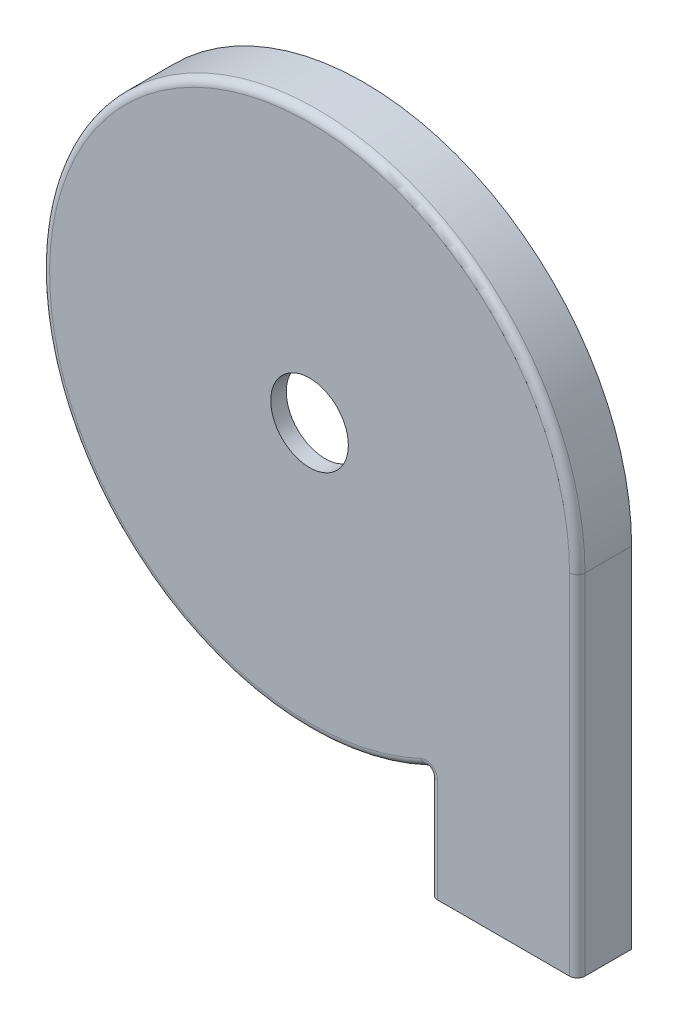
ISO-10303-21;
HEADER;
FILE_DESCRIPTION(('STEP AP214'),'2;1');
FILE_NAME('part.step','',(''),(''),'','','');
FILE_SCHEMA(('AUTOMOTIVE_DESIGN { 1 0 10303 214 1 1 1 1 }'));
ENDSEC;
DATA;
#1=APPLICATION_CONTEXT('core data for automotive mechanical design processes');
#2=APPLICATION_PROTOCOL_DEFINITION('international standard','automotive_design',2000,#1);
#3=PRODUCT_CONTEXT('',#1,'mechanical');
#4=PRODUCT('Part','Part','',(#3));
#5=PRODUCT_RELATED_PRODUCT_CATEGORY('part','',(#4));
#6=PRODUCT_DEFINITION_FORMATION('','',#4);
#7=PRODUCT_DEFINITION_CONTEXT('part definition',#1,'design');
#8=PRODUCT_DEFINITION('design','',#6,#7);
#9=PRODUCT_DEFINITION_SHAPE('','',#8);
#10=(LENGTH_UNIT() NAMED_UNIT(*) SI_UNIT(.MILLI.,.METRE.));
#11=(NAMED_UNIT(*) PLANE_ANGLE_UNIT() SI_UNIT($,.RADIAN.));
#12=(NAMED_UNIT(*) SI_UNIT($,.STERADIAN.) SOLID_ANGLE_UNIT());
#13=UNCERTAINTY_MEASURE_WITH_UNIT(LENGTH_MEASURE(1.E-05),#10,'distance_accuracy_value','');
#14=(GEOMETRIC_REPRESENTATION_CONTEXT(3) GLOBAL_UNCERTAINTY_ASSIGNED_CONTEXT((#13)) GLOBAL_UNIT_ASSIGNED_CONTEXT((#10,
#11,#12)) REPRESENTATION_CONTEXT('',''));
#15=CARTESIAN_POINT('',(0.,0.,0.));
#16=DIRECTION('',(0.,0.,1.));
#17=DIRECTION('',(1.,0.,0.));
#18=AXIS2_PLACEMENT_3D('',#15,#16,#17);
#19=CARTESIAN_POINT('',(14.5518746687865,-25.9953256212916,2.));
#20=DIRECTION('',(1.,0.,0.));
#21=DIRECTION('',(0.,1.,0.));
#22=AXIS2_PLACEMENT_3D('',#19,#20,#21);
#23=PLANE('',#22);
#24=DIRECTION('',(0.,0.,-1.));
#25=VECTOR('',#24,1.);
#26=CARTESIAN_POINT('',(14.5518746687865,-39.3725490196078,1.));
#27=LINE('',#26,#25);
#28=CARTESIAN_POINT('',(14.5518746687865,-39.3725490196078,1.));
#29=VERTEX_POINT('',#28);
#30=CARTESIAN_POINT('',(14.5518746687865,-39.3725490196078,-5.));
#31=VERTEX_POINT('',#30);
#32=EDGE_CURVE('E165',#29,#31,#27,.T.);
#33=ORIENTED_EDGE('',*,*,#32,.F.);
#34=DIRECTION('',(0.,-1.,0.));
#35=VECTOR('',#34,1.);
#36=CARTESIAN_POINT('',(14.5518746687865,-25.9953256212916,1.));
#37=LINE('',#36,#35);
#38=CARTESIAN_POINT('',(14.5518746687865,-25.9953256212916,1.));
#39=VERTEX_POINT('',#38);
#40=EDGE_CURVE('E251',#29,#39,#37,.F.);
#41=ORIENTED_EDGE('',*,*,#40,.T.);
#42=DIRECTION('',(0.,0.,-1.));
#43=VECTOR('',#42,1.);
#44=CARTESIAN_POINT('',(14.5518746687865,-25.9953256212916,2.));
#45=LINE('',#44,#43);
#46=CARTESIAN_POINT('',(14.5518746687865,-25.9953256212916,-5.));
#47=VERTEX_POINT('',#46);
#48=EDGE_CURVE('E190',#39,#47,#45,.T.);
#49=ORIENTED_EDGE('',*,*,#48,.T.);
#50=DIRECTION('',(0.,-1.,0.));
#51=VECTOR('',#50,1.);
#52=CARTESIAN_POINT('',(14.5518746687865,-25.9953256212916,-5.));
#53=LINE('',#52,#51);
#54=EDGE_CURVE('E182',#47,#31,#53,.T.);
#55=ORIENTED_EDGE('',*,*,#54,.T.);
#56=EDGE_LOOP('',(#33,#41,#49,#55));
#57=FACE_BOUND('',#56,.T.);
#58=ADVANCED_FACE('F43',(#57),#23,.F.);
#59=CARTESIAN_POINT('',(33.5518746687865,-41.3725490196078,2.));
#60=DIRECTION('',(-1.,0.,0.));
#61=DIRECTION('',(0.,0.,1.));
#62=AXIS2_PLACEMENT_3D('',#59,#60,#61);
#63=PLANE('',#62);
#64=DIRECTION('',(0.,0.,1.));
#65=VECTOR('',#64,1.);
#66=CARTESIAN_POINT('',(33.5518746687865,-39.3725490196078,-5.));
#67=LINE('',#66,#65);
#68=CARTESIAN_POINT('',(33.5518746687865,-39.3725490196078,-5.));
#69=VERTEX_POINT('',#68);
#70=CARTESIAN_POINT('',(33.5518746687865,-39.3725490196078,1.));
#71=VERTEX_POINT('',#70);
#72=EDGE_CURVE('E61',#69,#71,#67,.T.);
#73=ORIENTED_EDGE('',*,*,#72,.F.);
#74=DIRECTION('',(0.,1.,0.));
#75=VECTOR('',#74,1.);
#76=CARTESIAN_POINT('',(33.5518746687865,-41.3725490196078,-5.));
#77=LINE('',#76,#75);
#78=CARTESIAN_POINT('',(33.5518746687865,5.62745098039216,-5.));
#79=VERTEX_POINT('',#78);
#80=EDGE_CURVE('E192',#69,#79,#77,.T.);
#81=ORIENTED_EDGE('',*,*,#80,.T.);
#82=DIRECTION('',(0.,0.,-1.));
#83=VECTOR('',#82,1.);
#84=CARTESIAN_POINT('',(33.5518746687865,5.62745098039216,2.));
#85=LINE('',#84,#83);
#86=CARTESIAN_POINT('',(33.5518746687865,5.62745098039216,1.));
#87=VERTEX_POINT('',#86);
#88=EDGE_CURVE('E228',#87,#79,#85,.T.);
#89=ORIENTED_EDGE('',*,*,#88,.F.);
#90=DIRECTION('',(0.,1.,0.));
#91=VECTOR('',#90,1.);
#92=CARTESIAN_POINT('',(33.5518746687865,-41.3725490196078,1.));
#93=LINE('',#92,#91);
#94=EDGE_CURVE('E247',#87,#71,#93,.F.);
#95=ORIENTED_EDGE('',*,*,#94,.T.);
#96=EDGE_LOOP('',(#73,#81,#89,#95));
#97=FACE_BOUND('',#96,.T.);
#98=ADVANCED_FACE('F420',(#97),#63,.F.);
#99=CARTESIAN_POINT('',(-0.948125331213558,5.62745098039216,2.));
#100=DIRECTION('',(0.,0.,1.));
#101=DIRECTION('',(1.,0.,0.));
#102=AXIS2_PLACEMENT_3D('',#99,#100,#101);
#103=PLANE('',#102);
#104=CARTESIAN_POINT('',(-0.948125331213558,5.62745098039216,2.));
#105=DIRECTION('',(0.,0.,1.));
#106=DIRECTION('',(1.,0.,0.));
#107=AXIS2_PLACEMENT_3D('',#104,#105,#106);
#108=CIRCLE('',#107,5.);
#109=CARTESIAN_POINT('',(4.05187466878644,5.62745098039216,2.));
#110=VERTEX_POINT('',#109);
#111=EDGE_CURVE('E393',#110,#110,#108,.T.);
#112=ORIENTED_EDGE('',*,*,#111,.F.);
#113=EDGE_LOOP('',(#112));
#114=FACE_BOUND('',#113,.T.);
#115=DIRECTION('',(0.,-1.,0.));
#116=VECTOR('',#115,1.);
#117=CARTESIAN_POINT('',(15.5518746687865,-41.3725490196078,2.));
#118=LINE('',#117,#116);
#119=CARTESIAN_POINT('',(15.5518746687864,-25.9953256212916,2.));
#120=VERTEX_POINT('',#119);
#121=CARTESIAN_POINT('',(15.5518746687865,-39.3725490196078,2.));
#122=VERTEX_POINT('',#121);
#123=EDGE_CURVE('E240',#120,#122,#118,.T.);
#124=ORIENTED_EDGE('',*,*,#123,.T.);
#125=DIRECTION('',(-1.,0.,0.));
#126=VECTOR('',#125,1.);
#127=CARTESIAN_POINT('',(32.5518746687865,-39.3725490196078,2.));
#128=LINE('',#127,#126);
#129=CARTESIAN_POINT('',(32.5518746687865,-39.3725490196078,2.));
#130=VERTEX_POINT('',#129);
#131=EDGE_CURVE('E399',#130,#122,#128,.T.);
#132=ORIENTED_EDGE('',*,*,#131,.F.);
#133=DIRECTION('',(0.,1.,0.));
#134=VECTOR('',#133,1.);
#135=CARTESIAN_POINT('',(32.5518746687865,5.62745098039216,2.));
#136=LINE('',#135,#134);
#137=CARTESIAN_POINT('',(32.5518746687865,5.62745098039216,2.));
#138=VERTEX_POINT('',#137);
#139=EDGE_CURVE('E244',#130,#138,#136,.T.);
#140=ORIENTED_EDGE('',*,*,#139,.T.);
#141=CARTESIAN_POINT('',(-0.948125331213558,5.62745098039216,2.));
#142=DIRECTION('',(0.,0.,1.));
#143=DIRECTION('',(1.,0.,0.));
#144=AXIS2_PLACEMENT_3D('',#141,#142,#143);
#145=CIRCLE('',#144,33.5);
#146=CARTESIAN_POINT('',(13.4090175259293,-24.6400637669338,2.));
#147=VERTEX_POINT('',#146);
#148=EDGE_CURVE('E234',#138,#147,#145,.T.);
#149=ORIENTED_EDGE('',*,*,#148,.T.);
#150=CARTESIAN_POINT('',(14.0518746687864,-25.9953256212916,2.));
#151=DIRECTION('',(0.,0.,1.));
#152=DIRECTION('',(1.,0.,0.));
#153=AXIS2_PLACEMENT_3D('',#150,#151,#152);
#154=CIRCLE('',#153,1.49999999999999);
#155=EDGE_CURVE('E237',#147,#120,#154,.F.);
#156=ORIENTED_EDGE('',*,*,#155,.T.);
#157=EDGE_LOOP('',(#124,#132,#140,#149,#156));
#158=FACE_BOUND('',#157,.T.);
#159=ADVANCED_FACE('F435',(#114,#158),#103,.T.);
#160=CARTESIAN_POINT('',(-0.948125331213558,5.62745098039216,-5.));
#161=DIRECTION('',(0.,0.,1.));
#162=DIRECTION('',(1.,0.,0.));
#163=AXIS2_PLACEMENT_3D('',#160,#161,#162);
#164=PLANE('',#163);
#165=DIRECTION('',(1.,0.,0.));
#166=VECTOR('',#165,1.);
#167=CARTESIAN_POINT('',(14.5518746687865,-39.3725490196078,-5.));
#168=LINE('',#167,#166);
#169=CARTESIAN_POINT('',(16.5518746687864,-39.3725490196078,-5.));
#170=VERTEX_POINT('',#169);
#171=EDGE_CURVE('E168',#31,#170,#168,.T.);
#172=ORIENTED_EDGE('',*,*,#171,.F.);
#173=ORIENTED_EDGE('',*,*,#54,.F.);
#174=CARTESIAN_POINT('',(14.0518746687864,-25.9953256212916,-5.));
#175=DIRECTION('',(0.,0.,-1.));
#176=DIRECTION('',(1.,0.,0.));
#177=AXIS2_PLACEMENT_3D('',#174,#175,#176);
#178=CIRCLE('',#177,0.5);
#179=CARTESIAN_POINT('',(13.8375889545007,-25.543571669839,-5.));
#180=VERTEX_POINT('',#179);
#181=EDGE_CURVE('E209',#180,#47,#178,.T.);
#182=ORIENTED_EDGE('',*,*,#181,.F.);
#183=CARTESIAN_POINT('',(-0.948125331213558,5.62745098039216,-5.));
#184=DIRECTION('',(0.,0.,1.));
#185=DIRECTION('',(1.,0.,0.));
#186=AXIS2_PLACEMENT_3D('',#183,#184,#185);
#187=CIRCLE('',#186,34.5);
#188=EDGE_CURVE('E197',#79,#180,#187,.T.);
#189=ORIENTED_EDGE('',*,*,#188,.F.);
#190=ORIENTED_EDGE('',*,*,#80,.F.);
#191=DIRECTION('',(1.,0.,0.));
#192=VECTOR('',#191,1.);
#193=CARTESIAN_POINT('',(31.5518746687865,-39.3725490196078,-5.));
#194=LINE('',#193,#192);
#195=CARTESIAN_POINT('',(31.5518746687865,-39.3725490196078,-5.));
#196=VERTEX_POINT('',#195);
#197=EDGE_CURVE('E407',#196,#69,#194,.T.);
#198=ORIENTED_EDGE('',*,*,#197,.F.);
#199=DIRECTION('',(0.,1.,0.));
#200=VECTOR('',#199,1.);
#201=CARTESIAN_POINT('',(31.5518746687865,-39.3725490196078,-5.));
#202=LINE('',#201,#200);
#203=CARTESIAN_POINT('',(31.5518746687864,5.62745098039216,-5.));
#204=VERTEX_POINT('',#203);
#205=EDGE_CURVE('E306',#196,#204,#202,.T.);
#206=ORIENTED_EDGE('',*,*,#205,.T.);
#207=CARTESIAN_POINT('',(-0.948125331213558,5.62745098039216,-5.));
#208=DIRECTION('',(0.,0.,1.));
#209=DIRECTION('',(1.,0.,0.));
#210=AXIS2_PLACEMENT_3D('',#207,#208,#209);
#211=CIRCLE('',#210,32.5);
#212=CARTESIAN_POINT('',(12.9804460973579,-23.7365558640285,-5.));
#213=VERTEX_POINT('',#212);
#214=EDGE_CURVE('E310',#204,#213,#211,.T.);
#215=ORIENTED_EDGE('',*,*,#214,.T.);
#216=CARTESIAN_POINT('',(14.0518746687864,-25.9953256212916,-5.));
#217=DIRECTION('',(0.,0.,-1.));
#218=DIRECTION('',(1.,0.,0.));
#219=AXIS2_PLACEMENT_3D('',#216,#217,#218);
#220=CIRCLE('',#219,2.5);
#221=CARTESIAN_POINT('',(16.5518746687864,-25.9953256212916,-5.));
#222=VERTEX_POINT('',#221);
#223=EDGE_CURVE('E314',#213,#222,#220,.T.);
#224=ORIENTED_EDGE('',*,*,#223,.T.);
#225=DIRECTION('',(0.,-1.,0.));
#226=VECTOR('',#225,1.);
#227=CARTESIAN_POINT('',(16.5518746687864,-25.9953256212916,-5.));
#228=LINE('',#227,#226);
#229=EDGE_CURVE('E186',#222,#170,#228,.T.);
#230=ORIENTED_EDGE('',*,*,#229,.T.);
#231=EDGE_LOOP('',(#172,#173,#182,#189,#190,#198,#206,#215,#224,#230));
#232=FACE_BOUND('',#231,.T.);
#233=ADVANCED_FACE('F180',(#232),#164,.F.);
#234=CARTESIAN_POINT('',(16.5518746687864,-25.9953256212916,-5.));
#235=DIRECTION('',(-1.,0.,0.));
#236=DIRECTION('',(0.,0.,1.));
#237=AXIS2_PLACEMENT_3D('',#234,#235,#236);
#238=PLANE('',#237);
#239=DIRECTION('',(0.,0.,1.));
#240=VECTOR('',#239,1.);
#241=CARTESIAN_POINT('',(16.5518746687864,-39.3725490196078,-5.));
#242=LINE('',#241,#240);
#243=CARTESIAN_POINT('',(16.5518746687864,-39.3725490196078,0.));
#244=VERTEX_POINT('',#243);
#245=EDGE_CURVE('E188',#170,#244,#242,.T.);
#246=ORIENTED_EDGE('',*,*,#245,.F.);
#247=ORIENTED_EDGE('',*,*,#229,.F.);
#248=DIRECTION('',(0.,0.,1.));
#249=VECTOR('',#248,1.);
#250=CARTESIAN_POINT('',(16.5518746687864,-25.9953256212916,-5.));
#251=LINE('',#250,#249);
#252=CARTESIAN_POINT('',(16.5518746687864,-25.9953256212916,0.));
#253=VERTEX_POINT('',#252);
#254=EDGE_CURVE('E193',#222,#253,#251,.T.);
#255=ORIENTED_EDGE('',*,*,#254,.T.);
#256=DIRECTION('',(0.,-1.,0.));
#257=VECTOR('',#256,1.);
#258=CARTESIAN_POINT('',(16.5518746687864,-25.9953256212916,0.));
#259=LINE('',#258,#257);
#260=EDGE_CURVE('E293',#253,#244,#259,.T.);
#261=ORIENTED_EDGE('',*,*,#260,.T.);
#262=EDGE_LOOP('',(#246,#247,#255,#261));
#263=FACE_BOUND('',#262,.T.);
#264=ADVANCED_FACE('F364',(#263),#238,.F.);
#265=CARTESIAN_POINT('',(31.5518746687865,-39.3725490196078,-5.));
#266=DIRECTION('',(1.,0.,0.));
#267=DIRECTION('',(0.,1.,0.));
#268=AXIS2_PLACEMENT_3D('',#265,#266,#267);
#269=PLANE('',#268);
#270=DIRECTION('',(0.,0.,-1.));
#271=VECTOR('',#270,1.);
#272=CARTESIAN_POINT('',(31.5518746687865,-39.3725490196078,0.));
#273=LINE('',#272,#271);
#274=CARTESIAN_POINT('',(31.5518746687865,-39.3725490196078,0.));
#275=VERTEX_POINT('',#274);
#276=EDGE_CURVE('E358',#275,#196,#273,.T.);
#277=ORIENTED_EDGE('',*,*,#276,.F.);
#278=DIRECTION('',(0.,1.,0.));
#279=VECTOR('',#278,1.);
#280=CARTESIAN_POINT('',(31.5518746687865,-39.3725490196078,0.));
#281=LINE('',#280,#279);
#282=CARTESIAN_POINT('',(31.5518746687864,5.62745098039216,0.));
#283=VERTEX_POINT('',#282);
#284=EDGE_CURVE('E321',#275,#283,#281,.T.);
#285=ORIENTED_EDGE('',*,*,#284,.T.);
#286=DIRECTION('',(0.,0.,1.));
#287=VECTOR('',#286,1.);
#288=CARTESIAN_POINT('',(31.5518746687864,5.62745098039216,-5.));
#289=LINE('',#288,#287);
#290=CARTESIAN_POINT('',(31.5518746687864,5.62745098039216,-3.));
#291=VERTEX_POINT('',#290);
#292=EDGE_CURVE('E317',#291,#283,#289,.T.);
#293=ORIENTED_EDGE('',*,*,#292,.F.);
#294=DIRECTION('',(0.,0.,-1.));
#295=VECTOR('',#294,1.);
#296=CARTESIAN_POINT('',(31.5518746687864,5.62745098039216,-3.));
#297=LINE('',#296,#295);
#298=CARTESIAN_POINT('',(31.5518746687864,5.62745098039216,-4.));
#299=VERTEX_POINT('',#298);
#300=EDGE_CURVE('E294',#291,#299,#297,.T.);
#301=ORIENTED_EDGE('',*,*,#300,.T.);
#302=EDGE_CURVE('E203',#204,#299,#289,.T.);
#303=ORIENTED_EDGE('',*,*,#302,.F.);
#304=ORIENTED_EDGE('',*,*,#205,.F.);
#305=EDGE_LOOP('',(#277,#285,#293,#301,#303,#304));
#306=FACE_BOUND('',#305,.T.);
#307=ADVANCED_FACE('F355',(#306),#269,.F.);
#308=CARTESIAN_POINT('',(-0.948125331213558,5.62745098039216,0.));
#309=DIRECTION('',(0.,0.,1.));
#310=DIRECTION('',(1.,0.,0.));
#311=AXIS2_PLACEMENT_3D('',#308,#309,#310);
#312=PLANE('',#311);
#313=CARTESIAN_POINT('',(-0.948125331213558,5.62745098039216,0.));
#314=DIRECTION('',(0.,0.,1.));
#315=DIRECTION('',(1.,0.,0.));
#316=AXIS2_PLACEMENT_3D('',#313,#314,#315);
#317=CIRCLE('',#316,5.);
#318=CARTESIAN_POINT('',(4.05187466878644,5.62745098039216,0.));
#319=VERTEX_POINT('',#318);
#320=EDGE_CURVE('E47',#319,#319,#317,.T.);
#321=ORIENTED_EDGE('',*,*,#320,.T.);
#322=EDGE_LOOP('',(#321));
#323=FACE_BOUND('',#322,.T.);
#324=DIRECTION('',(1.,0.,0.));
#325=VECTOR('',#324,1.);
#326=CARTESIAN_POINT('',(16.5518746687864,-39.3725490196078,0.));
#327=LINE('',#326,#325);
#328=EDGE_CURVE('E412',#244,#275,#327,.T.);
#329=ORIENTED_EDGE('',*,*,#328,.F.);
#330=ORIENTED_EDGE('',*,*,#260,.F.);
#331=CARTESIAN_POINT('',(14.0518746687864,-25.9953256212916,0.));
#332=DIRECTION('',(0.,0.,-1.));
#333=DIRECTION('',(1.,0.,0.));
#334=AXIS2_PLACEMENT_3D('',#331,#332,#333);
#335=CIRCLE('',#334,2.5);
#336=CARTESIAN_POINT('',(12.9804460973579,-23.7365558640285,0.));
#337=VERTEX_POINT('',#336);
#338=EDGE_CURVE('E307',#337,#253,#335,.T.);
#339=ORIENTED_EDGE('',*,*,#338,.F.);
#340=CARTESIAN_POINT('',(-0.948125331213558,5.62745098039216,0.));
#341=DIRECTION('',(0.,0.,1.));
#342=DIRECTION('',(1.,0.,0.));
#343=AXIS2_PLACEMENT_3D('',#340,#341,#342);
#344=CIRCLE('',#343,32.5);
#345=EDGE_CURVE('E324',#283,#337,#344,.T.);
#346=ORIENTED_EDGE('',*,*,#345,.F.);
#347=ORIENTED_EDGE('',*,*,#284,.F.);
#348=EDGE_LOOP('',(#329,#330,#339,#346,#347));
#349=FACE_BOUND('',#348,.T.);
#350=ADVANCED_FACE('F361',(#323,#349),#312,.F.);
#351=CARTESIAN_POINT('',(15.5518746687864,5.62745098039216,1.));
#352=DIRECTION('',(0.,1.,0.));
#353=DIRECTION('',(-1.,0.,0.));
#354=AXIS2_PLACEMENT_3D('',#351,#352,#353);
#355=CYLINDRICAL_SURFACE('',#354,1.);
#356=ORIENTED_EDGE('',*,*,#40,.F.);
#357=CARTESIAN_POINT('',(15.5518746687865,-39.3725490196078,1.));
#358=DIRECTION('',(0.,-1.,0.));
#359=DIRECTION('',(0.,0.,-1.));
#360=AXIS2_PLACEMENT_3D('',#357,#358,#359);
#361=CIRCLE('',#360,1.);
#362=EDGE_CURVE('E171',#122,#29,#361,.T.);
#363=ORIENTED_EDGE('',*,*,#362,.F.);
#364=ORIENTED_EDGE('',*,*,#123,.F.);
#365=CARTESIAN_POINT('',(15.5518746687864,-25.9953256212916,1.));
#366=DIRECTION('',(0.,1.,0.));
#367=DIRECTION('',(0.,0.,1.));
#368=AXIS2_PLACEMENT_3D('',#365,#366,#367);
#369=CIRCLE('',#368,1.);
#370=EDGE_CURVE('E263',#39,#120,#369,.T.);
#371=ORIENTED_EDGE('',*,*,#370,.F.);
#372=EDGE_LOOP('',(#356,#363,#364,#371));
#373=FACE_BOUND('',#372,.T.);
#374=ADVANCED_FACE('F45',(#373),#355,.T.);
#375=CARTESIAN_POINT('',(32.5518746687865,5.62745098039216,1.));
#376=DIRECTION('',(0.,-1.,0.));
#377=DIRECTION('',(0.,0.,-1.));
#378=AXIS2_PLACEMENT_3D('',#375,#376,#377);
#379=CYLINDRICAL_SURFACE('',#378,1.);
#380=ORIENTED_EDGE('',*,*,#139,.F.);
#381=CARTESIAN_POINT('',(32.5518746687865,-39.3725490196078,1.));
#382=DIRECTION('',(0.,-1.,0.));
#383=DIRECTION('',(0.,0.,-1.));
#384=AXIS2_PLACEMENT_3D('',#381,#382,#383);
#385=CIRCLE('',#384,1.);
#386=EDGE_CURVE('E402',#71,#130,#385,.T.);
#387=ORIENTED_EDGE('',*,*,#386,.F.);
#388=ORIENTED_EDGE('',*,*,#94,.F.);
#389=CARTESIAN_POINT('',(32.5518746687865,5.62745098039216,1.));
#390=DIRECTION('',(0.,-1.,0.));
#391=DIRECTION('',(0.,0.,-1.));
#392=AXIS2_PLACEMENT_3D('',#389,#390,#391);
#393=CIRCLE('',#392,1.);
#394=EDGE_CURVE('E256',#87,#138,#393,.T.);
#395=ORIENTED_EDGE('',*,*,#394,.T.);
#396=EDGE_LOOP('',(#380,#387,#388,#395));
#397=FACE_BOUND('',#396,.T.);
#398=ADVANCED_FACE('F432',(#397),#379,.T.);
#399=CARTESIAN_POINT('',(14.0518746687864,-25.9953256212916,2.));
#400=DIRECTION('',(0.,0.,-1.));
#401=DIRECTION('',(-1.,0.,0.));
#402=AXIS2_PLACEMENT_3D('',#399,#400,#401);
#403=CYLINDRICAL_SURFACE('',#402,0.499999999999993);
#404=ORIENTED_EDGE('',*,*,#48,.F.);
#405=CARTESIAN_POINT('',(14.0518746687864,-25.9953256212916,1.));
#406=DIRECTION('',(0.,0.,1.));
#407=DIRECTION('',(1.,0.,0.));
#408=AXIS2_PLACEMENT_3D('',#405,#406,#407);
#409=CIRCLE('',#408,0.499999999999993);
#410=CARTESIAN_POINT('',(13.8375889545007,-25.543571669839,1.));
#411=VERTEX_POINT('',#410);
#412=EDGE_CURVE('E53',#39,#411,#409,.T.);
#413=ORIENTED_EDGE('',*,*,#412,.T.);
#414=DIRECTION('',(0.,0.,-1.));
#415=VECTOR('',#414,1.);
#416=CARTESIAN_POINT('',(13.8375889545007,-25.543571669839,2.));
#417=LINE('',#416,#415);
#418=EDGE_CURVE('E225',#411,#180,#417,.T.);
#419=ORIENTED_EDGE('',*,*,#418,.T.);
#420=ORIENTED_EDGE('',*,*,#181,.T.);
#421=EDGE_LOOP('',(#404,#413,#419,#420));
#422=FACE_BOUND('',#421,.T.);
#423=ADVANCED_FACE('F438',(#422),#403,.F.);
#424=CARTESIAN_POINT('',(-0.948125331213558,5.62745098039216,2.));
#425=DIRECTION('',(0.,0.,-1.));
#426=DIRECTION('',(-1.,0.,0.));
#427=AXIS2_PLACEMENT_3D('',#424,#425,#426);
#428=CYLINDRICAL_SURFACE('',#427,34.5);
#429=ORIENTED_EDGE('',*,*,#418,.F.);
#430=CARTESIAN_POINT('',(-0.948125331213558,5.62745098039216,1.));
#431=DIRECTION('',(0.,0.,1.));
#432=DIRECTION('',(1.,0.,0.));
#433=AXIS2_PLACEMENT_3D('',#430,#431,#432);
#434=CIRCLE('',#433,34.5);
#435=EDGE_CURVE('E11',#411,#87,#434,.F.);
#436=ORIENTED_EDGE('',*,*,#435,.T.);
#437=ORIENTED_EDGE('',*,*,#88,.T.);
#438=ORIENTED_EDGE('',*,*,#188,.T.);
#439=EDGE_LOOP('',(#429,#436,#437,#438));
#440=FACE_BOUND('',#439,.T.);
#441=ADVANCED_FACE('F423',(#440),#428,.T.);
#442=CARTESIAN_POINT('',(-0.948125331213558,5.62745098039216,-5.));
#443=DIRECTION('',(0.,0.,1.));
#444=DIRECTION('',(1.,0.,0.));
#445=AXIS2_PLACEMENT_3D('',#442,#443,#444);
#446=CYLINDRICAL_SURFACE('',#445,32.5);
#447=CARTESIAN_POINT('',(-0.948125331213558,5.62745098039216,-3.));
#448=DIRECTION('',(0.,0.,-1.));
#449=DIRECTION('',(-1.,0.,0.));
#450=AXIS2_PLACEMENT_3D('',#447,#448,#449);
#451=CIRCLE('',#450,32.5);
#452=CARTESIAN_POINT('',(12.9804460973579,-23.7365558640285,-3.));
#453=VERTEX_POINT('',#452);
#454=EDGE_CURVE('E351',#291,#453,#451,.F.);
#455=ORIENTED_EDGE('',*,*,#454,.F.);
#456=ORIENTED_EDGE('',*,*,#292,.T.);
#457=ORIENTED_EDGE('',*,*,#345,.T.);
#458=DIRECTION('',(0.,0.,1.));
#459=VECTOR('',#458,1.);
#460=CARTESIAN_POINT('',(12.9804460973579,-23.7365558640285,-5.));
#461=LINE('',#460,#459);
#462=EDGE_CURVE('E332',#453,#337,#461,.T.);
#463=ORIENTED_EDGE('',*,*,#462,.F.);
#464=EDGE_LOOP('',(#455,#456,#457,#463));
#465=FACE_BOUND('',#464,.T.);
#466=ADVANCED_FACE('F348',(#465),#446,.F.);
#467=CARTESIAN_POINT('',(14.0518746687864,-25.9953256212916,-5.));
#468=DIRECTION('',(0.,0.,1.));
#469=DIRECTION('',(1.,0.,0.));
#470=AXIS2_PLACEMENT_3D('',#467,#468,#469);
#471=CYLINDRICAL_SURFACE('',#470,2.5);
#472=ORIENTED_EDGE('',*,*,#338,.T.);
#473=ORIENTED_EDGE('',*,*,#254,.F.);
#474=ORIENTED_EDGE('',*,*,#223,.F.);
#475=CARTESIAN_POINT('',(12.9804460973579,-23.7365558640285,-4.));
#476=VERTEX_POINT('',#475);
#477=EDGE_CURVE('E200',#213,#476,#461,.T.);
#478=ORIENTED_EDGE('',*,*,#477,.T.);
#479=DIRECTION('',(0.,0.,-1.));
#480=VECTOR('',#479,1.);
#481=CARTESIAN_POINT('',(12.9804460973579,-23.7365558640285,-3.));
#482=LINE('',#481,#480);
#483=EDGE_CURVE('E297',#453,#476,#482,.T.);
#484=ORIENTED_EDGE('',*,*,#483,.F.);
#485=ORIENTED_EDGE('',*,*,#462,.T.);
#486=EDGE_LOOP('',(#472,#473,#474,#478,#484,#485));
#487=FACE_BOUND('',#486,.T.);
#488=ADVANCED_FACE('F362',(#487),#471,.T.);
#489=ORIENTED_EDGE('',*,*,#302,.T.);
#490=CARTESIAN_POINT('',(-0.948125331213558,5.62745098039216,-4.));
#491=DIRECTION('',(0.,0.,-1.));
#492=DIRECTION('',(-1.,0.,0.));
#493=AXIS2_PLACEMENT_3D('',#490,#491,#492);
#494=CIRCLE('',#493,32.5);
#495=EDGE_CURVE('E272',#299,#476,#494,.F.);
#496=ORIENTED_EDGE('',*,*,#495,.T.);
#497=ORIENTED_EDGE('',*,*,#477,.F.);
#498=ORIENTED_EDGE('',*,*,#214,.F.);
#499=EDGE_LOOP('',(#489,#496,#497,#498));
#500=FACE_BOUND('',#499,.T.);
#501=ADVANCED_FACE('F366',(#500),#446,.F.);
#502=CARTESIAN_POINT('',(-0.948125331213558,5.62745098039216,-3.));
#503=DIRECTION('',(0.,0.,-1.));
#504=DIRECTION('',(-1.,0.,0.));
#505=AXIS2_PLACEMENT_3D('',#502,#503,#504);
#506=CYLINDRICAL_SURFACE('',#505,32.);
#507=DIRECTION('',(0.,0.,-1.));
#508=VECTOR('',#507,1.);
#509=CARTESIAN_POINT('',(12.7661603830722,-23.2848019125759,-3.));
#510=LINE('',#509,#508);
#511=CARTESIAN_POINT('',(12.7661603830722,-23.2848019125759,-3.));
#512=VERTEX_POINT('',#511);
#513=CARTESIAN_POINT('',(12.7661603830722,-23.2848019125759,-3.75));
#514=VERTEX_POINT('',#513);
#515=EDGE_CURVE('E300',#512,#514,#510,.T.);
#516=ORIENTED_EDGE('',*,*,#515,.T.);
#517=CARTESIAN_POINT('',(-0.948125331213558,5.62745098039216,-3.75));
#518=DIRECTION('',(0.,0.,-1.));
#519=DIRECTION('',(-1.,0.,0.));
#520=AXIS2_PLACEMENT_3D('',#517,#518,#519);
#521=CIRCLE('',#520,32.);
#522=CARTESIAN_POINT('',(31.0518746687864,5.62745098039216,-3.75));
#523=VERTEX_POINT('',#522);
#524=EDGE_CURVE('E212',#514,#523,#521,.T.);
#525=ORIENTED_EDGE('',*,*,#524,.T.);
#526=DIRECTION('',(0.,0.,-1.));
#527=VECTOR('',#526,1.);
#528=CARTESIAN_POINT('',(31.0518746687864,5.62745098039216,-3.));
#529=LINE('',#528,#527);
#530=CARTESIAN_POINT('',(31.0518746687864,5.62745098039216,-3.));
#531=VERTEX_POINT('',#530);
#532=EDGE_CURVE('E289',#531,#523,#529,.T.);
#533=ORIENTED_EDGE('',*,*,#532,.F.);
#534=CARTESIAN_POINT('',(-0.948125331213558,5.62745098039216,-3.));
#535=DIRECTION('',(0.,0.,-1.));
#536=DIRECTION('',(-1.,0.,0.));
#537=AXIS2_PLACEMENT_3D('',#534,#535,#536);
#538=CIRCLE('',#537,32.);
#539=EDGE_CURVE('E288',#512,#531,#538,.T.);
#540=ORIENTED_EDGE('',*,*,#539,.F.);
#541=EDGE_LOOP('',(#516,#525,#533,#540));
#542=FACE_BOUND('',#541,.T.);
#543=ADVANCED_FACE('F380',(#542),#506,.F.);
#544=CARTESIAN_POINT('',(0.,5.6274509803921,-3.));
#545=DIRECTION('',(0.,-1.,0.));
#546=DIRECTION('',(1.,0.,0.));
#547=AXIS2_PLACEMENT_3D('',#544,#545,#546);
#548=PLANE('',#547);
#549=ORIENTED_EDGE('',*,*,#532,.T.);
#550=CARTESIAN_POINT('',(31.3018746687864,5.62745098039222,-3.75));
#551=DIRECTION('',(0.,-1.,0.));
#552=DIRECTION('',(1.,0.,0.));
#553=AXIS2_PLACEMENT_3D('',#550,#551,#552);
#554=CIRCLE('',#553,0.25);
#555=CARTESIAN_POINT('',(31.3018746687864,5.62745098039216,-4.));
#556=VERTEX_POINT('',#555);
#557=EDGE_CURVE('E216',#523,#556,#554,.T.);
#558=ORIENTED_EDGE('',*,*,#557,.T.);
#559=DIRECTION('',(-1.,0.,0.));
#560=VECTOR('',#559,1.);
#561=CARTESIAN_POINT('',(0.,5.6274509803921,-4.));
#562=LINE('',#561,#560);
#563=EDGE_CURVE('E279',#299,#556,#562,.T.);
#564=ORIENTED_EDGE('',*,*,#563,.F.);
#565=ORIENTED_EDGE('',*,*,#300,.F.);
#566=DIRECTION('',(-1.,0.,0.));
#567=VECTOR('',#566,1.);
#568=CARTESIAN_POINT('',(0.,5.6274509803921,-3.));
#569=LINE('',#568,#567);
#570=EDGE_CURVE('E282',#291,#531,#569,.T.);
#571=ORIENTED_EDGE('',*,*,#570,.T.);
#572=EDGE_LOOP('',(#549,#558,#564,#565,#571));
#573=FACE_BOUND('',#572,.T.);
#574=ADVANCED_FACE('F372',(#573),#548,.T.);
#575=CARTESIAN_POINT('',(1.40506860949806,0.666482561222899,-3.));
#576=DIRECTION('',(-0.903507902905261,-0.428571428571409,0.));
#577=DIRECTION('',(0.428571428571409,-0.903507902905261,0.));
#578=AXIS2_PLACEMENT_3D('',#575,#576,#577);
#579=PLANE('',#578);
#580=DIRECTION('',(-0.428571428571409,0.903507902905261,0.));
#581=VECTOR('',#580,1.);
#582=CARTESIAN_POINT('',(1.40506860949806,0.666482561222899,-4.));
#583=LINE('',#582,#581);
#584=CARTESIAN_POINT('',(12.873303240215,-23.5106788883022,-4.));
#585=VERTEX_POINT('',#584);
#586=EDGE_CURVE('E266',#476,#585,#583,.T.);
#587=ORIENTED_EDGE('',*,*,#586,.T.);
#588=CARTESIAN_POINT('',(12.8733032402144,-23.5106788883025,-3.75));
#589=DIRECTION('',(-0.903507902905261,-0.428571428571409,0.));
#590=DIRECTION('',(0.428571428571409,-0.903507902905261,0.));
#591=AXIS2_PLACEMENT_3D('',#588,#589,#590);
#592=CIRCLE('',#591,0.25);
#593=EDGE_CURVE('E222',#585,#514,#592,.F.);
#594=ORIENTED_EDGE('',*,*,#593,.T.);
#595=ORIENTED_EDGE('',*,*,#515,.F.);
#596=DIRECTION('',(-0.428571428571409,0.903507902905261,0.));
#597=VECTOR('',#596,1.);
#598=CARTESIAN_POINT('',(1.40506860949806,0.666482561222899,-3.));
#599=LINE('',#598,#597);
#600=EDGE_CURVE('E385',#453,#512,#599,.T.);
#601=ORIENTED_EDGE('',*,*,#600,.F.);
#602=ORIENTED_EDGE('',*,*,#483,.T.);
#603=EDGE_LOOP('',(#587,#594,#595,#601,#602));
#604=FACE_BOUND('',#603,.T.);
#605=ADVANCED_FACE('F384',(#604),#579,.F.);
#606=CARTESIAN_POINT('',(0.,0.,-3.));
#607=DIRECTION('',(0.,0.,-1.));
#608=DIRECTION('',(-1.,0.,0.));
#609=AXIS2_PLACEMENT_3D('',#606,#607,#608);
#610=PLANE('',#609);
#611=ORIENTED_EDGE('',*,*,#539,.T.);
#612=ORIENTED_EDGE('',*,*,#570,.F.);
#613=ORIENTED_EDGE('',*,*,#454,.T.);
#614=ORIENTED_EDGE('',*,*,#600,.T.);
#615=EDGE_LOOP('',(#611,#612,#613,#614));
#616=FACE_BOUND('',#615,.T.);
#617=ADVANCED_FACE('F472',(#616),#610,.F.);
#618=CARTESIAN_POINT('',(0.,0.,-4.));
#619=DIRECTION('',(0.,0.,-1.));
#620=DIRECTION('',(-1.,0.,0.));
#621=AXIS2_PLACEMENT_3D('',#618,#619,#620);
#622=PLANE('',#621);
#623=ORIENTED_EDGE('',*,*,#563,.T.);
#624=CARTESIAN_POINT('',(-0.948125331213558,5.62745098039216,-4.));
#625=DIRECTION('',(0.,0.,-1.));
#626=DIRECTION('',(-1.,0.,0.));
#627=AXIS2_PLACEMENT_3D('',#624,#625,#626);
#628=CIRCLE('',#627,32.25);
#629=EDGE_CURVE('E219',#556,#585,#628,.F.);
#630=ORIENTED_EDGE('',*,*,#629,.T.);
#631=ORIENTED_EDGE('',*,*,#586,.F.);
#632=ORIENTED_EDGE('',*,*,#495,.F.);
#633=EDGE_LOOP('',(#623,#630,#631,#632));
#634=FACE_BOUND('',#633,.T.);
#635=ADVANCED_FACE('F369',(#634),#622,.T.);
#636=CARTESIAN_POINT('',(-0.948125331213558,5.62745098039216,-3.75));
#637=DIRECTION('',(0.,0.,-1.));
#638=DIRECTION('',(-1.,0.,0.));
#639=AXIS2_PLACEMENT_3D('',#636,#637,#638);
#640=TOROIDAL_SURFACE('',#639,32.25,0.25);
#641=ORIENTED_EDGE('',*,*,#593,.F.);
#642=ORIENTED_EDGE('',*,*,#629,.F.);
#643=ORIENTED_EDGE('',*,*,#557,.F.);
#644=ORIENTED_EDGE('',*,*,#524,.F.);
#645=EDGE_LOOP('',(#641,#642,#643,#644));
#646=FACE_BOUND('',#645,.T.);
#647=ADVANCED_FACE('F378',(#646),#640,.T.);
#648=CARTESIAN_POINT('',(14.0518746687864,-25.9953256212916,1.));
#649=DIRECTION('',(0.,0.,1.));
#650=DIRECTION('',(1.,0.,0.));
#651=AXIS2_PLACEMENT_3D('',#648,#649,#650);
#652=TOROIDAL_SURFACE('',#651,1.49999999999999,1.);
#653=ORIENTED_EDGE('',*,*,#370,.T.);
#654=ORIENTED_EDGE('',*,*,#155,.F.);
#655=CARTESIAN_POINT('',(13.4090175259293,-24.6400637669338,1.));
#656=DIRECTION('',(-0.903507902905254,-0.428571428571422,0.));
#657=DIRECTION('',(0.428571428571422,-0.903507902905255,0.));
#658=AXIS2_PLACEMENT_3D('',#655,#656,#657);
#659=CIRCLE('',#658,1.);
#660=EDGE_CURVE('E260',#411,#147,#659,.T.);
#661=ORIENTED_EDGE('',*,*,#660,.F.);
#662=ORIENTED_EDGE('',*,*,#412,.F.);
#663=EDGE_LOOP('',(#653,#654,#661,#662));
#664=FACE_BOUND('',#663,.T.);
#665=ADVANCED_FACE('F457',(#664),#652,.T.);
#666=CARTESIAN_POINT('',(-0.948125331213558,5.62745098039216,1.));
#667=DIRECTION('',(0.,0.,1.));
#668=DIRECTION('',(1.,0.,0.));
#669=AXIS2_PLACEMENT_3D('',#666,#667,#668);
#670=TOROIDAL_SURFACE('',#669,33.5,1.);
#671=ORIENTED_EDGE('',*,*,#660,.T.);
#672=ORIENTED_EDGE('',*,*,#148,.F.);
#673=ORIENTED_EDGE('',*,*,#394,.F.);
#674=ORIENTED_EDGE('',*,*,#435,.F.);
#675=EDGE_LOOP('',(#671,#672,#673,#674));
#676=FACE_BOUND('',#675,.T.);
#677=ADVANCED_FACE('F428',(#676),#670,.T.);
#678=CARTESIAN_POINT('',(-0.948125331213558,5.62745098039216,-5.));
#679=DIRECTION('',(0.,0.,1.));
#680=DIRECTION('',(1.,0.,0.));
#681=AXIS2_PLACEMENT_3D('',#678,#679,#680);
#682=CYLINDRICAL_SURFACE('',#681,5.);
#683=ORIENTED_EDGE('',*,*,#111,.T.);
#684=EDGE_LOOP('',(#683));
#685=FACE_BOUND('',#684,.T.);
#686=ORIENTED_EDGE('',*,*,#320,.F.);
#687=EDGE_LOOP('',(#686));
#688=FACE_BOUND('',#687,.T.);
#689=ADVANCED_FACE('F479',(#685,#688),#682,.F.);
#690=CARTESIAN_POINT('',(32.5518746687865,-39.3725490196078,1.));
#691=DIRECTION('',(0.,-1.,0.));
#692=DIRECTION('',(0.,0.,-1.));
#693=AXIS2_PLACEMENT_3D('',#690,#691,#692);
#694=PLANE('',#693);
#695=ORIENTED_EDGE('',*,*,#32,.T.);
#696=ORIENTED_EDGE('',*,*,#171,.T.);
#697=ORIENTED_EDGE('',*,*,#245,.T.);
#698=ORIENTED_EDGE('',*,*,#328,.T.);
#699=ORIENTED_EDGE('',*,*,#276,.T.);
#700=ORIENTED_EDGE('',*,*,#197,.T.);
#701=ORIENTED_EDGE('',*,*,#72,.T.);
#702=ORIENTED_EDGE('',*,*,#386,.T.);
#703=ORIENTED_EDGE('',*,*,#131,.T.);
#704=ORIENTED_EDGE('',*,*,#362,.T.);
#705=EDGE_LOOP('',(#695,#696,#697,#698,#699,#700,#701,#702,#703,#704));
#706=FACE_BOUND('',#705,.T.);
#707=ADVANCED_FACE('F167',(#706),#694,.T.);
#708=CLOSED_SHELL('',(#58,#98,#159,#233,#264,#307,#350,#374,#398,#423,#441,#466,#488,#501,#543,
#574,#605,#617,#635,#647,#665,#677,#689,#707));
#709=MANIFOLD_SOLID_BREP('B2',#708);
#710=ADVANCED_BREP_SHAPE_REPRESENTATION('',(#18,#709),#14);
#711=SHAPE_DEFINITION_REPRESENTATION(#9,#710);
ENDSEC;
END-ISO-10303-21;
